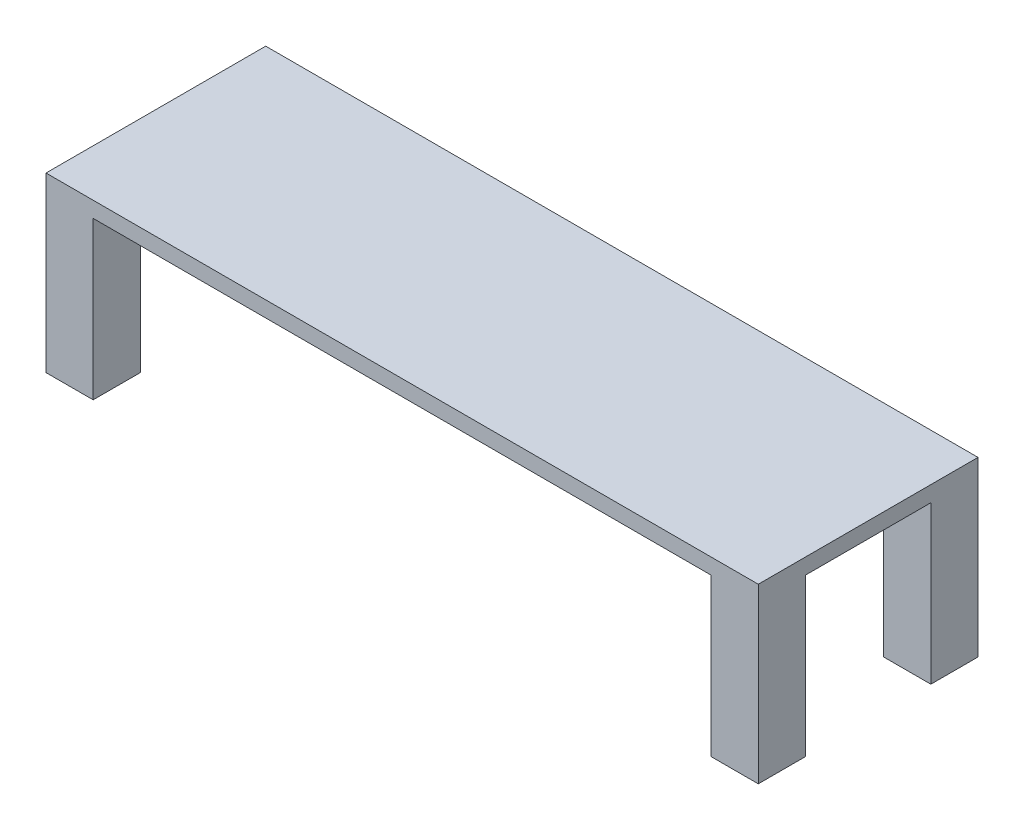
ISO-10303-21;
HEADER;
FILE_DESCRIPTION(('STEP AP214'),'2;1');
FILE_NAME('part.step','',(''),(''),'','','');
FILE_SCHEMA(('AUTOMOTIVE_DESIGN { 1 0 10303 214 1 1 1 1 }'));
ENDSEC;
DATA;
#1=APPLICATION_CONTEXT('core data for automotive mechanical design processes');
#2=APPLICATION_PROTOCOL_DEFINITION('international standard','automotive_design',2000,#1);
#3=PRODUCT_CONTEXT('',#1,'mechanical');
#4=PRODUCT('Part','Part','',(#3));
#5=PRODUCT_RELATED_PRODUCT_CATEGORY('part','',(#4));
#6=PRODUCT_DEFINITION_FORMATION('','',#4);
#7=PRODUCT_DEFINITION_CONTEXT('part definition',#1,'design');
#8=PRODUCT_DEFINITION('design','',#6,#7);
#9=PRODUCT_DEFINITION_SHAPE('','',#8);
#10=(LENGTH_UNIT() NAMED_UNIT(*) SI_UNIT(.MILLI.,.METRE.));
#11=(NAMED_UNIT(*) PLANE_ANGLE_UNIT() SI_UNIT($,.RADIAN.));
#12=(NAMED_UNIT(*) SI_UNIT($,.STERADIAN.) SOLID_ANGLE_UNIT());
#13=UNCERTAINTY_MEASURE_WITH_UNIT(LENGTH_MEASURE(1.E-05),#10,'distance_accuracy_value','');
#14=(GEOMETRIC_REPRESENTATION_CONTEXT(3) GLOBAL_UNCERTAINTY_ASSIGNED_CONTEXT((#13)) GLOBAL_UNIT_ASSIGNED_CONTEXT((#10,
#11,#12)) REPRESENTATION_CONTEXT('',''));
#15=CARTESIAN_POINT('',(0.,0.,0.));
#16=DIRECTION('',(0.,0.,1.));
#17=DIRECTION('',(1.,0.,0.));
#18=AXIS2_PLACEMENT_3D('',#15,#16,#17);
#19=CARTESIAN_POINT('',(0.,0.,0.));
#20=DIRECTION('',(0.,-1.,0.));
#21=DIRECTION('',(0.,0.,-1.));
#22=AXIS2_PLACEMENT_3D('',#19,#20,#21);
#23=PLANE('',#22);
#24=DIRECTION('',(0.,0.,-1.));
#25=VECTOR('',#24,1.);
#26=CARTESIAN_POINT('',(-98.3,0.,19.95));
#27=LINE('',#26,#25);
#28=CARTESIAN_POINT('',(-98.3,0.,34.95));
#29=VERTEX_POINT('',#28);
#30=CARTESIAN_POINT('',(-98.3,0.,19.95));
#31=VERTEX_POINT('',#30);
#32=EDGE_CURVE('E317',#29,#31,#27,.T.);
#33=ORIENTED_EDGE('',*,*,#32,.F.);
#34=DIRECTION('',(1.,0.,0.));
#35=VECTOR('',#34,1.);
#36=CARTESIAN_POINT('',(-98.3,0.,34.95));
#37=LINE('',#36,#35);
#38=CARTESIAN_POINT('',(-113.3,0.,34.95));
#39=VERTEX_POINT('',#38);
#40=EDGE_CURVE('E323',#39,#29,#37,.T.);
#41=ORIENTED_EDGE('',*,*,#40,.F.);
#42=DIRECTION('',(0.,0.,1.));
#43=VECTOR('',#42,1.);
#44=CARTESIAN_POINT('',(-113.3,0.,34.95));
#45=LINE('',#44,#43);
#46=CARTESIAN_POINT('',(-113.3,0.,19.95));
#47=VERTEX_POINT('',#46);
#48=EDGE_CURVE('E335',#47,#39,#45,.T.);
#49=ORIENTED_EDGE('',*,*,#48,.F.);
#50=DIRECTION('',(-1.,0.,0.));
#51=VECTOR('',#50,1.);
#52=CARTESIAN_POINT('',(-113.3,0.,19.95));
#53=LINE('',#52,#51);
#54=EDGE_CURVE('E331',#31,#47,#53,.T.);
#55=ORIENTED_EDGE('',*,*,#54,.F.);
#56=EDGE_LOOP('',(#33,#41,#49,#55));
#57=FACE_BOUND('',#56,.T.);
#58=CARTESIAN_POINT('',(-105.8,0.,27.45));
#59=DIRECTION('',(0.,1.,0.));
#60=DIRECTION('',(0.,0.,1.));
#61=AXIS2_PLACEMENT_3D('',#58,#59,#60);
#62=CIRCLE('',#61,2.);
#63=CARTESIAN_POINT('',(-105.8,0.,29.45));
#64=VERTEX_POINT('',#63);
#65=EDGE_CURVE('E313',#64,#64,#62,.T.);
#66=ORIENTED_EDGE('',*,*,#65,.T.);
#67=EDGE_LOOP('',(#66));
#68=FACE_BOUND('',#67,.T.);
#69=ADVANCED_FACE('F45',(#57,#68),#23,.T.);
#70=CARTESIAN_POINT('',(-98.3,50.,19.95));
#71=DIRECTION('',(-1.,0.,0.));
#72=DIRECTION('',(0.,0.,1.));
#73=AXIS2_PLACEMENT_3D('',#70,#71,#72);
#74=PLANE('',#73);
#75=ORIENTED_EDGE('',*,*,#32,.T.);
#76=DIRECTION('',(0.,-1.,0.));
#77=VECTOR('',#76,1.);
#78=CARTESIAN_POINT('',(-98.3,50.,19.95));
#79=LINE('',#78,#77);
#80=CARTESIAN_POINT('',(-98.3,50.,19.95));
#81=VERTEX_POINT('',#80);
#82=EDGE_CURVE('E351',#81,#31,#79,.T.);
#83=ORIENTED_EDGE('',*,*,#82,.F.);
#84=DIRECTION('',(0.,0.,-1.));
#85=VECTOR('',#84,1.);
#86=CARTESIAN_POINT('',(-98.3,50.,19.95));
#87=LINE('',#86,#85);
#88=CARTESIAN_POINT('',(-98.3,50.,34.95));
#89=VERTEX_POINT('',#88);
#90=EDGE_CURVE('E318',#89,#81,#87,.T.);
#91=ORIENTED_EDGE('',*,*,#90,.F.);
#92=DIRECTION('',(0.,-1.,0.));
#93=VECTOR('',#92,1.);
#94=CARTESIAN_POINT('',(-98.3,50.,34.95));
#95=LINE('',#94,#93);
#96=EDGE_CURVE('E327',#89,#29,#95,.T.);
#97=ORIENTED_EDGE('',*,*,#96,.T.);
#98=EDGE_LOOP('',(#75,#83,#91,#97));
#99=FACE_BOUND('',#98,.T.);
#100=ADVANCED_FACE('F47',(#99),#74,.F.);
#101=CARTESIAN_POINT('',(-113.3,50.,19.95));
#102=DIRECTION('',(0.,0.,1.));
#103=DIRECTION('',(1.,0.,0.));
#104=AXIS2_PLACEMENT_3D('',#101,#102,#103);
#105=PLANE('',#104);
#106=ORIENTED_EDGE('',*,*,#54,.T.);
#107=DIRECTION('',(0.,-1.,0.));
#108=VECTOR('',#107,1.);
#109=CARTESIAN_POINT('',(-113.3,50.,19.95));
#110=LINE('',#109,#108);
#111=CARTESIAN_POINT('',(-113.3,55.,19.95));
#112=VERTEX_POINT('',#111);
#113=EDGE_CURVE('E347',#112,#47,#110,.T.);
#114=ORIENTED_EDGE('',*,*,#113,.F.);
#115=DIRECTION('',(-1.,0.,0.));
#116=VECTOR('',#115,1.);
#117=CARTESIAN_POINT('',(-113.3,55.,19.95));
#118=LINE('',#117,#116);
#119=CARTESIAN_POINT('',(113.3,55.,19.9499999999999));
#120=VERTEX_POINT('',#119);
#121=EDGE_CURVE('E283',#120,#112,#118,.T.);
#122=ORIENTED_EDGE('',*,*,#121,.F.);
#123=DIRECTION('',(0.,-1.,0.));
#124=VECTOR('',#123,1.);
#125=CARTESIAN_POINT('',(113.3,55.,19.9499999999999));
#126=LINE('',#125,#124);
#127=CARTESIAN_POINT('',(113.3,0.,19.9499999999999));
#128=VERTEX_POINT('',#127);
#129=EDGE_CURVE('E287',#120,#128,#126,.T.);
#130=ORIENTED_EDGE('',*,*,#129,.T.);
#131=DIRECTION('',(-1.,0.,0.));
#132=VECTOR('',#131,1.);
#133=CARTESIAN_POINT('',(113.3,0.,19.9499999999999));
#134=LINE('',#133,#132);
#135=CARTESIAN_POINT('',(98.2999999999999,0.,19.9499999999999));
#136=VERTEX_POINT('',#135);
#137=EDGE_CURVE('E171',#128,#136,#134,.T.);
#138=ORIENTED_EDGE('',*,*,#137,.T.);
#139=DIRECTION('',(0.,-1.,0.));
#140=VECTOR('',#139,1.);
#141=CARTESIAN_POINT('',(98.2999999999999,50.,19.9499999999999));
#142=LINE('',#141,#140);
#143=CARTESIAN_POINT('',(98.2999999999999,50.,19.9499999999999));
#144=VERTEX_POINT('',#143);
#145=EDGE_CURVE('E166',#144,#136,#142,.T.);
#146=ORIENTED_EDGE('',*,*,#145,.F.);
#147=DIRECTION('',(-1.,0.,0.));
#148=VECTOR('',#147,1.);
#149=CARTESIAN_POINT('',(-113.3,50.,19.95));
#150=LINE('',#149,#148);
#151=EDGE_CURVE('E277',#144,#81,#150,.T.);
#152=ORIENTED_EDGE('',*,*,#151,.T.);
#153=ORIENTED_EDGE('',*,*,#82,.T.);
#154=EDGE_LOOP('',(#106,#114,#122,#130,#138,#146,#152,#153));
#155=FACE_BOUND('',#154,.T.);
#156=ADVANCED_FACE('F395',(#155),#105,.F.);
#157=CARTESIAN_POINT('',(-113.3,50.,34.95));
#158=DIRECTION('',(1.,0.,0.));
#159=DIRECTION('',(0.,0.,-1.));
#160=AXIS2_PLACEMENT_3D('',#157,#158,#159);
#161=PLANE('',#160);
#162=ORIENTED_EDGE('',*,*,#48,.T.);
#163=DIRECTION('',(0.,-1.,0.));
#164=VECTOR('',#163,1.);
#165=CARTESIAN_POINT('',(-113.3,50.,34.95));
#166=LINE('',#165,#164);
#167=CARTESIAN_POINT('',(-113.3,50.,34.95));
#168=VERTEX_POINT('',#167);
#169=EDGE_CURVE('E343',#168,#39,#166,.T.);
#170=ORIENTED_EDGE('',*,*,#169,.F.);
#171=DIRECTION('',(0.,0.,1.));
#172=VECTOR('',#171,1.);
#173=CARTESIAN_POINT('',(-113.3,50.,89.85));
#174=LINE('',#173,#172);
#175=CARTESIAN_POINT('',(-113.3,50.,74.85));
#176=VERTEX_POINT('',#175);
#177=EDGE_CURVE('E271',#168,#176,#174,.T.);
#178=ORIENTED_EDGE('',*,*,#177,.T.);
#179=DIRECTION('',(0.,-1.,0.));
#180=VECTOR('',#179,1.);
#181=CARTESIAN_POINT('',(-113.3,50.,74.85));
#182=LINE('',#181,#180);
#183=CARTESIAN_POINT('',(-113.3,0.,74.85));
#184=VERTEX_POINT('',#183);
#185=EDGE_CURVE('E233',#176,#184,#182,.T.);
#186=ORIENTED_EDGE('',*,*,#185,.T.);
#187=DIRECTION('',(0.,0.,1.));
#188=VECTOR('',#187,1.);
#189=CARTESIAN_POINT('',(-113.3,0.,82.35));
#190=LINE('',#189,#188);
#191=CARTESIAN_POINT('',(-113.3,0.,89.85));
#192=VERTEX_POINT('',#191);
#193=EDGE_CURVE('E253',#184,#192,#190,.T.);
#194=ORIENTED_EDGE('',*,*,#193,.T.);
#195=DIRECTION('',(0.,-1.,0.));
#196=VECTOR('',#195,1.);
#197=CARTESIAN_POINT('',(-113.3,55.,89.85));
#198=LINE('',#197,#196);
#199=CARTESIAN_POINT('',(-113.3,55.,89.85));
#200=VERTEX_POINT('',#199);
#201=EDGE_CURVE('E306',#200,#192,#198,.T.);
#202=ORIENTED_EDGE('',*,*,#201,.F.);
#203=DIRECTION('',(0.,0.,1.));
#204=VECTOR('',#203,1.);
#205=CARTESIAN_POINT('',(-113.3,55.,89.85));
#206=LINE('',#205,#204);
#207=EDGE_CURVE('E272',#112,#200,#206,.T.);
#208=ORIENTED_EDGE('',*,*,#207,.F.);
#209=ORIENTED_EDGE('',*,*,#113,.T.);
#210=EDGE_LOOP('',(#162,#170,#178,#186,#194,#202,#208,#209));
#211=FACE_BOUND('',#210,.T.);
#212=ADVANCED_FACE('F406',(#211),#161,.F.);
#213=CARTESIAN_POINT('',(-98.3,50.,34.95));
#214=DIRECTION('',(0.,0.,-1.));
#215=DIRECTION('',(-1.,0.,0.));
#216=AXIS2_PLACEMENT_3D('',#213,#214,#215);
#217=PLANE('',#216);
#218=ORIENTED_EDGE('',*,*,#40,.T.);
#219=ORIENTED_EDGE('',*,*,#96,.F.);
#220=DIRECTION('',(1.,0.,0.));
#221=VECTOR('',#220,1.);
#222=CARTESIAN_POINT('',(-98.3,50.,34.95));
#223=LINE('',#222,#221);
#224=EDGE_CURVE('E322',#168,#89,#223,.T.);
#225=ORIENTED_EDGE('',*,*,#224,.F.);
#226=ORIENTED_EDGE('',*,*,#169,.T.);
#227=EDGE_LOOP('',(#218,#219,#225,#226));
#228=FACE_BOUND('',#227,.T.);
#229=ADVANCED_FACE('F403',(#228),#217,.F.);
#230=CARTESIAN_POINT('',(-105.8,50.,27.45));
#231=DIRECTION('',(0.,-1.,0.));
#232=DIRECTION('',(0.,0.,-1.));
#233=AXIS2_PLACEMENT_3D('',#230,#231,#232);
#234=CYLINDRICAL_SURFACE('',#233,2.);
#235=CARTESIAN_POINT('',(-105.8,50.,27.45));
#236=DIRECTION('',(0.,1.,0.));
#237=DIRECTION('',(0.,0.,1.));
#238=AXIS2_PLACEMENT_3D('',#235,#236,#237);
#239=CIRCLE('',#238,2.);
#240=CARTESIAN_POINT('',(-105.8,50.,29.45));
#241=VERTEX_POINT('',#240);
#242=EDGE_CURVE('E309',#241,#241,#239,.T.);
#243=ORIENTED_EDGE('',*,*,#242,.T.);
#244=EDGE_LOOP('',(#243));
#245=FACE_BOUND('',#244,.T.);
#246=ORIENTED_EDGE('',*,*,#65,.F.);
#247=EDGE_LOOP('',(#246));
#248=FACE_BOUND('',#247,.T.);
#249=ADVANCED_FACE('F401',(#245,#248),#234,.F.);
#250=CARTESIAN_POINT('',(0.,50.,0.));
#251=DIRECTION('',(0.,-1.,0.));
#252=DIRECTION('',(0.,0.,-1.));
#253=AXIS2_PLACEMENT_3D('',#250,#251,#252);
#254=PLANE('',#253);
#255=ORIENTED_EDGE('',*,*,#242,.F.);
#256=EDGE_LOOP('',(#255));
#257=FACE_BOUND('',#256,.T.);
#258=ADVANCED_FACE('F384',(#257),#254,.T.);
#259=CARTESIAN_POINT('',(113.3,55.,89.85));
#260=DIRECTION('',(0.,0.,-1.));
#261=DIRECTION('',(-1.,0.,0.));
#262=AXIS2_PLACEMENT_3D('',#259,#260,#261);
#263=PLANE('',#262);
#264=ORIENTED_EDGE('',*,*,#201,.T.);
#265=DIRECTION('',(1.,0.,0.));
#266=VECTOR('',#265,1.);
#267=CARTESIAN_POINT('',(-113.3,0.,89.85));
#268=LINE('',#267,#266);
#269=CARTESIAN_POINT('',(-98.3,0.,89.85));
#270=VERTEX_POINT('',#269);
#271=EDGE_CURVE('E249',#192,#270,#268,.T.);
#272=ORIENTED_EDGE('',*,*,#271,.T.);
#273=DIRECTION('',(0.,-1.,0.));
#274=VECTOR('',#273,1.);
#275=CARTESIAN_POINT('',(-98.3,50.,89.85));
#276=LINE('',#275,#274);
#277=CARTESIAN_POINT('',(-98.3,50.,89.85));
#278=VERTEX_POINT('',#277);
#279=EDGE_CURVE('E237',#278,#270,#276,.T.);
#280=ORIENTED_EDGE('',*,*,#279,.F.);
#281=DIRECTION('',(1.,0.,0.));
#282=VECTOR('',#281,1.);
#283=CARTESIAN_POINT('',(113.3,50.,89.85));
#284=LINE('',#283,#282);
#285=CARTESIAN_POINT('',(98.3,50.,89.85));
#286=VERTEX_POINT('',#285);
#287=EDGE_CURVE('E291',#278,#286,#284,.T.);
#288=ORIENTED_EDGE('',*,*,#287,.T.);
#289=DIRECTION('',(0.,-1.,0.));
#290=VECTOR('',#289,1.);
#291=CARTESIAN_POINT('',(98.3,50.,89.85));
#292=LINE('',#291,#290);
#293=CARTESIAN_POINT('',(98.3,0.,89.85));
#294=VERTEX_POINT('',#293);
#295=EDGE_CURVE('E190',#286,#294,#292,.T.);
#296=ORIENTED_EDGE('',*,*,#295,.T.);
#297=DIRECTION('',(1.,0.,0.));
#298=VECTOR('',#297,1.);
#299=CARTESIAN_POINT('',(113.3,0.,89.85));
#300=LINE('',#299,#298);
#301=CARTESIAN_POINT('',(113.3,0.,89.85));
#302=VERTEX_POINT('',#301);
#303=EDGE_CURVE('E216',#294,#302,#300,.T.);
#304=ORIENTED_EDGE('',*,*,#303,.T.);
#305=DIRECTION('',(0.,-1.,0.));
#306=VECTOR('',#305,1.);
#307=CARTESIAN_POINT('',(113.3,55.,89.85));
#308=LINE('',#307,#306);
#309=CARTESIAN_POINT('',(113.3,55.,89.85));
#310=VERTEX_POINT('',#309);
#311=EDGE_CURVE('E303',#310,#302,#308,.T.);
#312=ORIENTED_EDGE('',*,*,#311,.F.);
#313=DIRECTION('',(1.,0.,0.));
#314=VECTOR('',#313,1.);
#315=CARTESIAN_POINT('',(113.3,55.,89.85));
#316=LINE('',#315,#314);
#317=EDGE_CURVE('E276',#200,#310,#316,.T.);
#318=ORIENTED_EDGE('',*,*,#317,.F.);
#319=EDGE_LOOP('',(#264,#272,#280,#288,#296,#304,#312,#318));
#320=FACE_BOUND('',#319,.T.);
#321=ADVANCED_FACE('F452',(#320),#263,.F.);
#322=CARTESIAN_POINT('',(113.3,55.,19.9499999999999));
#323=DIRECTION('',(-1.,0.,0.));
#324=DIRECTION('',(0.,0.,1.));
#325=AXIS2_PLACEMENT_3D('',#322,#323,#324);
#326=PLANE('',#325);
#327=ORIENTED_EDGE('',*,*,#311,.T.);
#328=DIRECTION('',(0.,0.,-1.));
#329=VECTOR('',#328,1.);
#330=CARTESIAN_POINT('',(113.3,0.,74.85));
#331=LINE('',#330,#329);
#332=CARTESIAN_POINT('',(113.3,0.,74.85));
#333=VERTEX_POINT('',#332);
#334=EDGE_CURVE('E213',#302,#333,#331,.T.);
#335=ORIENTED_EDGE('',*,*,#334,.T.);
#336=DIRECTION('',(0.,-1.,0.));
#337=VECTOR('',#336,1.);
#338=CARTESIAN_POINT('',(113.3,50.,74.85));
#339=LINE('',#338,#337);
#340=CARTESIAN_POINT('',(113.3,50.,74.85));
#341=VERTEX_POINT('',#340);
#342=EDGE_CURVE('E202',#341,#333,#339,.T.);
#343=ORIENTED_EDGE('',*,*,#342,.F.);
#344=DIRECTION('',(0.,0.,-1.));
#345=VECTOR('',#344,1.);
#346=CARTESIAN_POINT('',(113.3,50.,19.9499999999999));
#347=LINE('',#346,#345);
#348=CARTESIAN_POINT('',(113.3,50.,34.9499999999999));
#349=VERTEX_POINT('',#348);
#350=EDGE_CURVE('E295',#341,#349,#347,.T.);
#351=ORIENTED_EDGE('',*,*,#350,.T.);
#352=DIRECTION('',(0.,-1.,0.));
#353=VECTOR('',#352,1.);
#354=CARTESIAN_POINT('',(113.3,50.,34.9499999999999));
#355=LINE('',#354,#353);
#356=CARTESIAN_POINT('',(113.3,0.,34.9499999999999));
#357=VERTEX_POINT('',#356);
#358=EDGE_CURVE('E425',#349,#357,#355,.T.);
#359=ORIENTED_EDGE('',*,*,#358,.T.);
#360=DIRECTION('',(0.,0.,-1.));
#361=VECTOR('',#360,1.);
#362=CARTESIAN_POINT('',(113.3,0.,27.4499999999999));
#363=LINE('',#362,#361);
#364=EDGE_CURVE('E182',#357,#128,#363,.T.);
#365=ORIENTED_EDGE('',*,*,#364,.T.);
#366=ORIENTED_EDGE('',*,*,#129,.F.);
#367=DIRECTION('',(0.,0.,-1.));
#368=VECTOR('',#367,1.);
#369=CARTESIAN_POINT('',(113.3,55.,19.9499999999999));
#370=LINE('',#369,#368);
#371=EDGE_CURVE('E280',#310,#120,#370,.T.);
#372=ORIENTED_EDGE('',*,*,#371,.F.);
#373=EDGE_LOOP('',(#327,#335,#343,#351,#359,#365,#366,#372));
#374=FACE_BOUND('',#373,.T.);
#375=ADVANCED_FACE('F424',(#374),#326,.F.);
#376=CARTESIAN_POINT('',(0.,55.,0.));
#377=DIRECTION('',(0.,-1.,0.));
#378=DIRECTION('',(0.,0.,-1.));
#379=AXIS2_PLACEMENT_3D('',#376,#377,#378);
#380=PLANE('',#379);
#381=ORIENTED_EDGE('',*,*,#207,.T.);
#382=ORIENTED_EDGE('',*,*,#317,.T.);
#383=ORIENTED_EDGE('',*,*,#371,.T.);
#384=ORIENTED_EDGE('',*,*,#121,.T.);
#385=EDGE_LOOP('',(#381,#382,#383,#384));
#386=FACE_BOUND('',#385,.T.);
#387=ADVANCED_FACE('F419',(#386),#380,.F.);
#388=DIRECTION('',(0.,0.,1.));
#389=VECTOR('',#388,1.);
#390=CARTESIAN_POINT('',(98.2999999999999,50.,19.9499999999999));
#391=LINE('',#390,#389);
#392=CARTESIAN_POINT('',(98.2999999999999,50.,34.9499999999999));
#393=VERTEX_POINT('',#392);
#394=EDGE_CURVE('E177',#144,#393,#391,.T.);
#395=ORIENTED_EDGE('',*,*,#394,.T.);
#396=DIRECTION('',(1.,0.,0.));
#397=VECTOR('',#396,1.);
#398=CARTESIAN_POINT('',(98.2999999999999,50.,34.9499999999999));
#399=LINE('',#398,#397);
#400=EDGE_CURVE('E61',#393,#349,#399,.T.);
#401=ORIENTED_EDGE('',*,*,#400,.T.);
#402=ORIENTED_EDGE('',*,*,#350,.F.);
#403=DIRECTION('',(-1.,0.,0.));
#404=VECTOR('',#403,1.);
#405=CARTESIAN_POINT('',(98.3,50.,74.85));
#406=LINE('',#405,#404);
#407=CARTESIAN_POINT('',(98.3,50.,74.85));
#408=VERTEX_POINT('',#407);
#409=EDGE_CURVE('E209',#341,#408,#406,.T.);
#410=ORIENTED_EDGE('',*,*,#409,.T.);
#411=DIRECTION('',(0.,0.,1.));
#412=VECTOR('',#411,1.);
#413=CARTESIAN_POINT('',(98.3,50.,89.85));
#414=LINE('',#413,#412);
#415=EDGE_CURVE('E69',#408,#286,#414,.T.);
#416=ORIENTED_EDGE('',*,*,#415,.T.);
#417=ORIENTED_EDGE('',*,*,#287,.F.);
#418=DIRECTION('',(0.,0.,-1.));
#419=VECTOR('',#418,1.);
#420=CARTESIAN_POINT('',(-98.3,50.,89.85));
#421=LINE('',#420,#419);
#422=CARTESIAN_POINT('',(-98.3,50.,74.85));
#423=VERTEX_POINT('',#422);
#424=EDGE_CURVE('E245',#278,#423,#421,.T.);
#425=ORIENTED_EDGE('',*,*,#424,.T.);
#426=DIRECTION('',(-1.,0.,0.));
#427=VECTOR('',#426,1.);
#428=CARTESIAN_POINT('',(-98.3,50.,74.85));
#429=LINE('',#428,#427);
#430=EDGE_CURVE('E250',#423,#176,#429,.T.);
#431=ORIENTED_EDGE('',*,*,#430,.T.);
#432=ORIENTED_EDGE('',*,*,#177,.F.);
#433=ORIENTED_EDGE('',*,*,#224,.T.);
#434=ORIENTED_EDGE('',*,*,#90,.T.);
#435=ORIENTED_EDGE('',*,*,#151,.F.);
#436=EDGE_LOOP('',(#395,#401,#402,#410,#416,#417,#425,#431,#432,#433,#434,#435));
#437=FACE_BOUND('',#436,.T.);
#438=ADVANCED_FACE('F377',(#437),#254,.T.);
#439=CARTESIAN_POINT('',(0.,0.,0.));
#440=DIRECTION('',(0.,1.,0.));
#441=DIRECTION('',(0.,0.,1.));
#442=AXIS2_PLACEMENT_3D('',#439,#440,#441);
#443=PLANE('',#442);
#444=DIRECTION('',(-1.,0.,0.));
#445=VECTOR('',#444,1.);
#446=CARTESIAN_POINT('',(-98.3,0.,74.85));
#447=LINE('',#446,#445);
#448=CARTESIAN_POINT('',(-98.3,0.,74.85));
#449=VERTEX_POINT('',#448);
#450=EDGE_CURVE('E257',#449,#184,#447,.T.);
#451=ORIENTED_EDGE('',*,*,#450,.F.);
#452=DIRECTION('',(0.,0.,-1.));
#453=VECTOR('',#452,1.);
#454=CARTESIAN_POINT('',(-98.3,0.,89.85));
#455=LINE('',#454,#453);
#456=EDGE_CURVE('E246',#270,#449,#455,.T.);
#457=ORIENTED_EDGE('',*,*,#456,.F.);
#458=ORIENTED_EDGE('',*,*,#271,.F.);
#459=ORIENTED_EDGE('',*,*,#193,.F.);
#460=EDGE_LOOP('',(#451,#457,#458,#459));
#461=FACE_BOUND('',#460,.T.);
#462=CARTESIAN_POINT('',(-105.8,0.,82.35));
#463=DIRECTION('',(0.,1.,0.));
#464=DIRECTION('',(0.,0.,-1.));
#465=AXIS2_PLACEMENT_3D('',#462,#463,#464);
#466=CIRCLE('',#465,2.);
#467=CARTESIAN_POINT('',(-105.8,0.,80.35));
#468=VERTEX_POINT('',#467);
#469=EDGE_CURVE('E261',#468,#468,#466,.T.);
#470=ORIENTED_EDGE('',*,*,#469,.T.);
#471=EDGE_LOOP('',(#470));
#472=FACE_BOUND('',#471,.T.);
#473=ADVANCED_FACE('F449',(#461,#472),#443,.F.);
#474=CARTESIAN_POINT('',(-98.3,50.,74.85));
#475=DIRECTION('',(0.,0.,1.));
#476=DIRECTION('',(1.,0.,0.));
#477=AXIS2_PLACEMENT_3D('',#474,#475,#476);
#478=PLANE('',#477);
#479=ORIENTED_EDGE('',*,*,#450,.T.);
#480=ORIENTED_EDGE('',*,*,#185,.F.);
#481=ORIENTED_EDGE('',*,*,#430,.F.);
#482=DIRECTION('',(0.,-1.,0.));
#483=VECTOR('',#482,1.);
#484=CARTESIAN_POINT('',(-98.3,50.,74.85));
#485=LINE('',#484,#483);
#486=EDGE_CURVE('E241',#423,#449,#485,.T.);
#487=ORIENTED_EDGE('',*,*,#486,.T.);
#488=EDGE_LOOP('',(#479,#480,#481,#487));
#489=FACE_BOUND('',#488,.T.);
#490=ADVANCED_FACE('F442',(#489),#478,.F.);
#491=CARTESIAN_POINT('',(-98.3,50.,89.85));
#492=DIRECTION('',(-1.,0.,0.));
#493=DIRECTION('',(0.,0.,1.));
#494=AXIS2_PLACEMENT_3D('',#491,#492,#493);
#495=PLANE('',#494);
#496=ORIENTED_EDGE('',*,*,#456,.T.);
#497=ORIENTED_EDGE('',*,*,#486,.F.);
#498=ORIENTED_EDGE('',*,*,#424,.F.);
#499=ORIENTED_EDGE('',*,*,#279,.T.);
#500=EDGE_LOOP('',(#496,#497,#498,#499));
#501=FACE_BOUND('',#500,.T.);
#502=ADVANCED_FACE('F445',(#501),#495,.F.);
#503=CARTESIAN_POINT('',(-105.8,50.,82.35));
#504=DIRECTION('',(0.,-1.,0.));
#505=DIRECTION('',(0.,0.,-1.));
#506=AXIS2_PLACEMENT_3D('',#503,#504,#505);
#507=CYLINDRICAL_SURFACE('',#506,2.);
#508=CARTESIAN_POINT('',(-105.8,50.,82.35));
#509=DIRECTION('',(0.,-1.,0.));
#510=DIRECTION('',(0.,0.,-1.));
#511=AXIS2_PLACEMENT_3D('',#508,#509,#510);
#512=CIRCLE('',#511,2.);
#513=CARTESIAN_POINT('',(-105.8,50.,80.35));
#514=VERTEX_POINT('',#513);
#515=EDGE_CURVE('E355',#514,#514,#512,.F.);
#516=ORIENTED_EDGE('',*,*,#515,.T.);
#517=EDGE_LOOP('',(#516));
#518=FACE_BOUND('',#517,.T.);
#519=ORIENTED_EDGE('',*,*,#469,.F.);
#520=EDGE_LOOP('',(#519));
#521=FACE_BOUND('',#520,.T.);
#522=ADVANCED_FACE('F382',(#518,#521),#507,.F.);
#523=ORIENTED_EDGE('',*,*,#515,.F.);
#524=EDGE_LOOP('',(#523));
#525=FACE_BOUND('',#524,.T.);
#526=ADVANCED_FACE('F368',(#525),#254,.T.);
#527=CARTESIAN_POINT('',(0.,0.,0.));
#528=DIRECTION('',(0.,-1.,0.));
#529=DIRECTION('',(0.,0.,-1.));
#530=AXIS2_PLACEMENT_3D('',#527,#528,#529);
#531=PLANE('',#530);
#532=DIRECTION('',(0.,0.,1.));
#533=VECTOR('',#532,1.);
#534=CARTESIAN_POINT('',(98.3,0.,89.85));
#535=LINE('',#534,#533);
#536=CARTESIAN_POINT('',(98.3,0.,74.85));
#537=VERTEX_POINT('',#536);
#538=EDGE_CURVE('E220',#537,#294,#535,.T.);
#539=ORIENTED_EDGE('',*,*,#538,.F.);
#540=DIRECTION('',(-1.,0.,0.));
#541=VECTOR('',#540,1.);
#542=CARTESIAN_POINT('',(98.3,0.,74.85));
#543=LINE('',#542,#541);
#544=EDGE_CURVE('E210',#333,#537,#543,.T.);
#545=ORIENTED_EDGE('',*,*,#544,.F.);
#546=ORIENTED_EDGE('',*,*,#334,.F.);
#547=ORIENTED_EDGE('',*,*,#303,.F.);
#548=EDGE_LOOP('',(#539,#545,#546,#547));
#549=FACE_BOUND('',#548,.T.);
#550=CARTESIAN_POINT('',(105.8,0.,82.35));
#551=DIRECTION('',(0.,1.,0.));
#552=DIRECTION('',(0.,0.,1.));
#553=AXIS2_PLACEMENT_3D('',#550,#551,#552);
#554=CIRCLE('',#553,2.);
#555=CARTESIAN_POINT('',(105.8,0.,84.35));
#556=VERTEX_POINT('',#555);
#557=EDGE_CURVE('E224',#556,#556,#554,.T.);
#558=ORIENTED_EDGE('',*,*,#557,.T.);
#559=EDGE_LOOP('',(#558));
#560=FACE_BOUND('',#559,.T.);
#561=ADVANCED_FACE('F381',(#549,#560),#531,.T.);
#562=CARTESIAN_POINT('',(98.3,50.,89.85));
#563=DIRECTION('',(1.,0.,0.));
#564=DIRECTION('',(0.,0.,-1.));
#565=AXIS2_PLACEMENT_3D('',#562,#563,#564);
#566=PLANE('',#565);
#567=ORIENTED_EDGE('',*,*,#538,.T.);
#568=ORIENTED_EDGE('',*,*,#295,.F.);
#569=ORIENTED_EDGE('',*,*,#415,.F.);
#570=DIRECTION('',(0.,-1.,0.));
#571=VECTOR('',#570,1.);
#572=CARTESIAN_POINT('',(98.3,50.,74.85));
#573=LINE('',#572,#571);
#574=EDGE_CURVE('E206',#408,#537,#573,.T.);
#575=ORIENTED_EDGE('',*,*,#574,.T.);
#576=EDGE_LOOP('',(#567,#568,#569,#575));
#577=FACE_BOUND('',#576,.T.);
#578=ADVANCED_FACE('F460',(#577),#566,.F.);
#579=CARTESIAN_POINT('',(98.3,50.,74.85));
#580=DIRECTION('',(0.,0.,1.));
#581=DIRECTION('',(1.,0.,0.));
#582=AXIS2_PLACEMENT_3D('',#579,#580,#581);
#583=PLANE('',#582);
#584=ORIENTED_EDGE('',*,*,#544,.T.);
#585=ORIENTED_EDGE('',*,*,#574,.F.);
#586=ORIENTED_EDGE('',*,*,#409,.F.);
#587=ORIENTED_EDGE('',*,*,#342,.T.);
#588=EDGE_LOOP('',(#584,#585,#586,#587));
#589=FACE_BOUND('',#588,.T.);
#590=ADVANCED_FACE('F375',(#589),#583,.F.);
#591=CARTESIAN_POINT('',(105.8,50.,82.35));
#592=DIRECTION('',(0.,-1.,0.));
#593=DIRECTION('',(0.,0.,-1.));
#594=AXIS2_PLACEMENT_3D('',#591,#592,#593);
#595=CYLINDRICAL_SURFACE('',#594,2.);
#596=CARTESIAN_POINT('',(105.8,50.,82.35));
#597=DIRECTION('',(0.,-1.,0.));
#598=DIRECTION('',(0.,0.,-1.));
#599=AXIS2_PLACEMENT_3D('',#596,#597,#598);
#600=CIRCLE('',#599,2.);
#601=CARTESIAN_POINT('',(105.8,50.,80.35));
#602=VERTEX_POINT('',#601);
#603=EDGE_CURVE('E54',#602,#602,#600,.F.);
#604=ORIENTED_EDGE('',*,*,#603,.T.);
#605=EDGE_LOOP('',(#604));
#606=FACE_BOUND('',#605,.T.);
#607=ORIENTED_EDGE('',*,*,#557,.F.);
#608=EDGE_LOOP('',(#607));
#609=FACE_BOUND('',#608,.T.);
#610=ADVANCED_FACE('F362',(#606,#609),#595,.F.);
#611=ORIENTED_EDGE('',*,*,#603,.F.);
#612=EDGE_LOOP('',(#611));
#613=FACE_BOUND('',#612,.T.);
#614=ADVANCED_FACE('F365',(#613),#254,.T.);
#615=CARTESIAN_POINT('',(0.,0.,0.));
#616=DIRECTION('',(0.,1.,0.));
#617=DIRECTION('',(0.,0.,1.));
#618=AXIS2_PLACEMENT_3D('',#615,#616,#617);
#619=PLANE('',#618);
#620=DIRECTION('',(1.,0.,0.));
#621=VECTOR('',#620,1.);
#622=CARTESIAN_POINT('',(98.2999999999999,0.,34.9499999999999));
#623=LINE('',#622,#621);
#624=CARTESIAN_POINT('',(98.2999999999999,0.,34.9499999999999));
#625=VERTEX_POINT('',#624);
#626=EDGE_CURVE('E175',#625,#357,#623,.T.);
#627=ORIENTED_EDGE('',*,*,#626,.F.);
#628=DIRECTION('',(0.,0.,1.));
#629=VECTOR('',#628,1.);
#630=CARTESIAN_POINT('',(98.2999999999999,0.,19.9499999999999));
#631=LINE('',#630,#629);
#632=EDGE_CURVE('E161',#136,#625,#631,.T.);
#633=ORIENTED_EDGE('',*,*,#632,.F.);
#634=ORIENTED_EDGE('',*,*,#137,.F.);
#635=ORIENTED_EDGE('',*,*,#364,.F.);
#636=EDGE_LOOP('',(#627,#633,#634,#635));
#637=FACE_BOUND('',#636,.T.);
#638=CARTESIAN_POINT('',(105.8,0.,27.45));
#639=DIRECTION('',(0.,1.,0.));
#640=DIRECTION('',(0.,0.,-1.));
#641=AXIS2_PLACEMENT_3D('',#638,#639,#640);
#642=CIRCLE('',#641,2.);
#643=CARTESIAN_POINT('',(105.8,0.,25.45));
#644=VERTEX_POINT('',#643);
#645=EDGE_CURVE('E185',#644,#644,#642,.T.);
#646=ORIENTED_EDGE('',*,*,#645,.T.);
#647=EDGE_LOOP('',(#646));
#648=FACE_BOUND('',#647,.T.);
#649=ADVANCED_FACE('F179',(#637,#648),#619,.F.);
#650=CARTESIAN_POINT('',(98.2999999999999,50.,34.9499999999999));
#651=DIRECTION('',(0.,0.,-1.));
#652=DIRECTION('',(-1.,0.,0.));
#653=AXIS2_PLACEMENT_3D('',#650,#651,#652);
#654=PLANE('',#653);
#655=ORIENTED_EDGE('',*,*,#626,.T.);
#656=ORIENTED_EDGE('',*,*,#358,.F.);
#657=ORIENTED_EDGE('',*,*,#400,.F.);
#658=DIRECTION('',(0.,-1.,0.));
#659=VECTOR('',#658,1.);
#660=CARTESIAN_POINT('',(98.2999999999999,50.,34.9499999999999));
#661=LINE('',#660,#659);
#662=EDGE_CURVE('E164',#393,#625,#661,.T.);
#663=ORIENTED_EDGE('',*,*,#662,.T.);
#664=EDGE_LOOP('',(#655,#656,#657,#663));
#665=FACE_BOUND('',#664,.T.);
#666=ADVANCED_FACE('F174',(#665),#654,.F.);
#667=CARTESIAN_POINT('',(98.2999999999999,50.,19.9499999999999));
#668=DIRECTION('',(1.,0.,0.));
#669=DIRECTION('',(0.,0.,-1.));
#670=AXIS2_PLACEMENT_3D('',#667,#668,#669);
#671=PLANE('',#670);
#672=ORIENTED_EDGE('',*,*,#632,.T.);
#673=ORIENTED_EDGE('',*,*,#662,.F.);
#674=ORIENTED_EDGE('',*,*,#394,.F.);
#675=ORIENTED_EDGE('',*,*,#145,.T.);
#676=EDGE_LOOP('',(#672,#673,#674,#675));
#677=FACE_BOUND('',#676,.T.);
#678=ADVANCED_FACE('F162',(#677),#671,.F.);
#679=CARTESIAN_POINT('',(105.8,50.,27.45));
#680=DIRECTION('',(0.,-1.,0.));
#681=DIRECTION('',(0.,0.,-1.));
#682=AXIS2_PLACEMENT_3D('',#679,#680,#681);
#683=CYLINDRICAL_SURFACE('',#682,2.);
#684=CARTESIAN_POINT('',(105.8,50.,27.45));
#685=DIRECTION('',(0.,-1.,0.));
#686=DIRECTION('',(0.,0.,-1.));
#687=AXIS2_PLACEMENT_3D('',#684,#685,#686);
#688=CIRCLE('',#687,2.);
#689=CARTESIAN_POINT('',(105.8,50.,25.45));
#690=VERTEX_POINT('',#689);
#691=EDGE_CURVE('E11',#690,#690,#688,.F.);
#692=ORIENTED_EDGE('',*,*,#691,.T.);
#693=EDGE_LOOP('',(#692));
#694=FACE_BOUND('',#693,.T.);
#695=ORIENTED_EDGE('',*,*,#645,.F.);
#696=EDGE_LOOP('',(#695));
#697=FACE_BOUND('',#696,.T.);
#698=ADVANCED_FACE('F386',(#694,#697),#683,.F.);
#699=ORIENTED_EDGE('',*,*,#691,.F.);
#700=EDGE_LOOP('',(#699));
#701=FACE_BOUND('',#700,.T.);
#702=ADVANCED_FACE('F369',(#701),#254,.T.);
#703=CLOSED_SHELL('',(#69,#100,#156,#212,#229,#249,#258,#321,#375,#387,#438,#473,#490,#502,#522,
#526,#561,#578,#590,#610,#614,#649,#666,#678,#698,#702));
#704=MANIFOLD_SOLID_BREP('B2',#703);
#705=ADVANCED_BREP_SHAPE_REPRESENTATION('',(#18,#704),#14);
#706=SHAPE_DEFINITION_REPRESENTATION(#9,#705);
ENDSEC;
END-ISO-10303-21;
